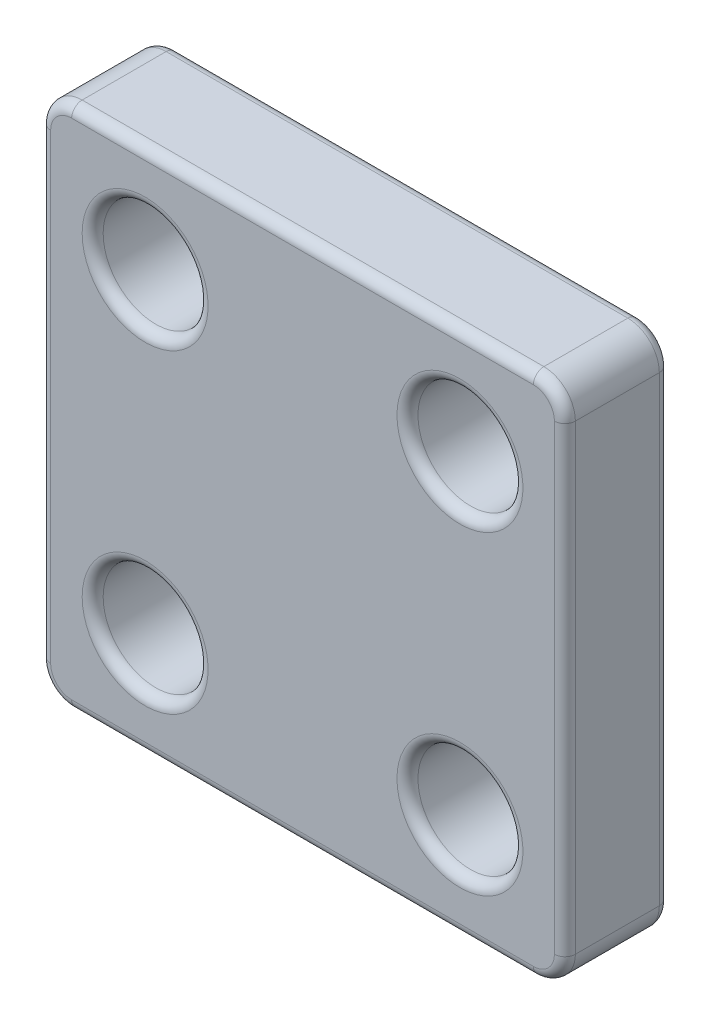
ISO-10303-21;
HEADER;
FILE_DESCRIPTION(('STEP AP214'),'2;1');
FILE_NAME('part.step','',(''),(''),'','','');
FILE_SCHEMA(('AUTOMOTIVE_DESIGN { 1 0 10303 214 1 1 1 1 }'));
ENDSEC;
DATA;
#1=APPLICATION_CONTEXT('core data for automotive mechanical design processes');
#2=APPLICATION_PROTOCOL_DEFINITION('international standard','automotive_design',2000,#1);
#3=PRODUCT_CONTEXT('',#1,'mechanical');
#4=PRODUCT('Part','Part','',(#3));
#5=PRODUCT_RELATED_PRODUCT_CATEGORY('part','',(#4));
#6=PRODUCT_DEFINITION_FORMATION('','',#4);
#7=PRODUCT_DEFINITION_CONTEXT('part definition',#1,'design');
#8=PRODUCT_DEFINITION('design','',#6,#7);
#9=PRODUCT_DEFINITION_SHAPE('','',#8);
#10=(LENGTH_UNIT() NAMED_UNIT(*) SI_UNIT(.MILLI.,.METRE.));
#11=(NAMED_UNIT(*) PLANE_ANGLE_UNIT() SI_UNIT($,.RADIAN.));
#12=(NAMED_UNIT(*) SI_UNIT($,.STERADIAN.) SOLID_ANGLE_UNIT());
#13=UNCERTAINTY_MEASURE_WITH_UNIT(LENGTH_MEASURE(1.E-05),#10,'distance_accuracy_value','');
#14=(GEOMETRIC_REPRESENTATION_CONTEXT(3) GLOBAL_UNCERTAINTY_ASSIGNED_CONTEXT((#13)) GLOBAL_UNIT_ASSIGNED_CONTEXT((#10,
#11,#12)) REPRESENTATION_CONTEXT('',''));
#15=CARTESIAN_POINT('',(0.,0.,0.));
#16=DIRECTION('',(0.,0.,1.));
#17=DIRECTION('',(1.,0.,0.));
#18=AXIS2_PLACEMENT_3D('',#15,#16,#17);
#19=CARTESIAN_POINT('',(-25.,25.,10.));
#20=DIRECTION('',(1.,0.,0.));
#21=DIRECTION('',(0.,1.,0.));
#22=AXIS2_PLACEMENT_3D('',#19,#20,#21);
#23=PLANE('',#22);
#24=DIRECTION('',(0.,0.,-1.));
#25=VECTOR('',#24,1.);
#26=CARTESIAN_POINT('',(-25.,22.,10.));
#27=LINE('',#26,#25);
#28=CARTESIAN_POINT('',(-25.,22.,9.));
#29=VERTEX_POINT('',#28);
#30=CARTESIAN_POINT('',(-25.,22.,0.999999999999999));
#31=VERTEX_POINT('',#30);
#32=EDGE_CURVE('E416',#29,#31,#27,.T.);
#33=ORIENTED_EDGE('',*,*,#32,.T.);
#34=DIRECTION('',(0.,-1.,0.));
#35=VECTOR('',#34,1.);
#36=CARTESIAN_POINT('',(-25.,-22.,0.999999999999999));
#37=LINE('',#36,#35);
#38=CARTESIAN_POINT('',(-25.,-22.,0.999999999999999));
#39=VERTEX_POINT('',#38);
#40=EDGE_CURVE('E260',#31,#39,#37,.T.);
#41=ORIENTED_EDGE('',*,*,#40,.T.);
#42=DIRECTION('',(0.,0.,-1.));
#43=VECTOR('',#42,1.);
#44=CARTESIAN_POINT('',(-25.,-22.,10.));
#45=LINE('',#44,#43);
#46=CARTESIAN_POINT('',(-25.,-22.,9.));
#47=VERTEX_POINT('',#46);
#48=EDGE_CURVE('E362',#39,#47,#45,.F.);
#49=ORIENTED_EDGE('',*,*,#48,.T.);
#50=DIRECTION('',(0.,-1.,0.));
#51=VECTOR('',#50,1.);
#52=CARTESIAN_POINT('',(-25.,25.,9.));
#53=LINE('',#52,#51);
#54=EDGE_CURVE('E257',#47,#29,#53,.F.);
#55=ORIENTED_EDGE('',*,*,#54,.T.);
#56=EDGE_LOOP('',(#33,#41,#49,#55));
#57=FACE_BOUND('',#56,.T.);
#58=ADVANCED_FACE('F41',(#57),#23,.F.);
#59=CARTESIAN_POINT('',(25.,-25.,10.));
#60=DIRECTION('',(0.,1.,0.));
#61=DIRECTION('',(-1.,0.,0.));
#62=AXIS2_PLACEMENT_3D('',#59,#60,#61);
#63=PLANE('',#62);
#64=DIRECTION('',(0.,0.,-1.));
#65=VECTOR('',#64,1.);
#66=CARTESIAN_POINT('',(-22.,-25.,10.));
#67=LINE('',#66,#65);
#68=CARTESIAN_POINT('',(-22.,-25.,9.));
#69=VERTEX_POINT('',#68);
#70=CARTESIAN_POINT('',(-22.,-25.,0.999999999999999));
#71=VERTEX_POINT('',#70);
#72=EDGE_CURVE('E410',#69,#71,#67,.T.);
#73=ORIENTED_EDGE('',*,*,#72,.T.);
#74=DIRECTION('',(1.,0.,0.));
#75=VECTOR('',#74,1.);
#76=CARTESIAN_POINT('',(22.,-25.,0.999999999999999));
#77=LINE('',#76,#75);
#78=CARTESIAN_POINT('',(22.,-25.,0.999999999999999));
#79=VERTEX_POINT('',#78);
#80=EDGE_CURVE('E248',#71,#79,#77,.T.);
#81=ORIENTED_EDGE('',*,*,#80,.T.);
#82=DIRECTION('',(0.,0.,-1.));
#83=VECTOR('',#82,1.);
#84=CARTESIAN_POINT('',(22.,-25.,10.));
#85=LINE('',#84,#83);
#86=CARTESIAN_POINT('',(22.,-25.,9.));
#87=VERTEX_POINT('',#86);
#88=EDGE_CURVE('E429',#79,#87,#85,.F.);
#89=ORIENTED_EDGE('',*,*,#88,.T.);
#90=DIRECTION('',(1.,0.,0.));
#91=VECTOR('',#90,1.);
#92=CARTESIAN_POINT('',(25.,-25.,9.));
#93=LINE('',#92,#91);
#94=EDGE_CURVE('E245',#87,#69,#93,.F.);
#95=ORIENTED_EDGE('',*,*,#94,.T.);
#96=EDGE_LOOP('',(#73,#81,#89,#95));
#97=FACE_BOUND('',#96,.T.);
#98=ADVANCED_FACE('F479',(#97),#63,.F.);
#99=CARTESIAN_POINT('',(25.,25.,10.));
#100=DIRECTION('',(-1.,0.,0.));
#101=DIRECTION('',(0.,-1.,0.));
#102=AXIS2_PLACEMENT_3D('',#99,#100,#101);
#103=PLANE('',#102);
#104=DIRECTION('',(0.,0.,-1.));
#105=VECTOR('',#104,1.);
#106=CARTESIAN_POINT('',(25.,-22.,10.));
#107=LINE('',#106,#105);
#108=CARTESIAN_POINT('',(25.,-22.,9.));
#109=VERTEX_POINT('',#108);
#110=CARTESIAN_POINT('',(25.,-22.,0.999999999999999));
#111=VERTEX_POINT('',#110);
#112=EDGE_CURVE('E184',#109,#111,#107,.T.);
#113=ORIENTED_EDGE('',*,*,#112,.T.);
#114=DIRECTION('',(0.,1.,0.));
#115=VECTOR('',#114,1.);
#116=CARTESIAN_POINT('',(25.,22.,0.999999999999999));
#117=LINE('',#116,#115);
#118=CARTESIAN_POINT('',(25.,22.,0.999999999999999));
#119=VERTEX_POINT('',#118);
#120=EDGE_CURVE('E236',#111,#119,#117,.T.);
#121=ORIENTED_EDGE('',*,*,#120,.T.);
#122=DIRECTION('',(0.,0.,-1.));
#123=VECTOR('',#122,1.);
#124=CARTESIAN_POINT('',(25.,22.,10.));
#125=LINE('',#124,#123);
#126=CARTESIAN_POINT('',(25.,22.,9.));
#127=VERTEX_POINT('',#126);
#128=EDGE_CURVE('E188',#119,#127,#125,.F.);
#129=ORIENTED_EDGE('',*,*,#128,.T.);
#130=DIRECTION('',(0.,1.,0.));
#131=VECTOR('',#130,1.);
#132=CARTESIAN_POINT('',(25.,25.,9.));
#133=LINE('',#132,#131);
#134=EDGE_CURVE('E233',#127,#109,#133,.F.);
#135=ORIENTED_EDGE('',*,*,#134,.T.);
#136=EDGE_LOOP('',(#113,#121,#129,#135));
#137=FACE_BOUND('',#136,.T.);
#138=ADVANCED_FACE('F438',(#137),#103,.F.);
#139=CARTESIAN_POINT('',(25.,25.,10.));
#140=DIRECTION('',(0.,-1.,0.));
#141=DIRECTION('',(1.,0.,0.));
#142=AXIS2_PLACEMENT_3D('',#139,#140,#141);
#143=PLANE('',#142);
#144=DIRECTION('',(0.,0.,-1.));
#145=VECTOR('',#144,1.);
#146=CARTESIAN_POINT('',(22.,25.,10.));
#147=LINE('',#146,#145);
#148=CARTESIAN_POINT('',(22.,25.,9.));
#149=VERTEX_POINT('',#148);
#150=CARTESIAN_POINT('',(22.,25.,0.999999999999999));
#151=VERTEX_POINT('',#150);
#152=EDGE_CURVE('E419',#149,#151,#147,.T.);
#153=ORIENTED_EDGE('',*,*,#152,.T.);
#154=DIRECTION('',(-1.,0.,0.));
#155=VECTOR('',#154,1.);
#156=CARTESIAN_POINT('',(-22.,25.,0.999999999999999));
#157=LINE('',#156,#155);
#158=CARTESIAN_POINT('',(-22.,25.,0.999999999999999));
#159=VERTEX_POINT('',#158);
#160=EDGE_CURVE('E11',#151,#159,#157,.T.);
#161=ORIENTED_EDGE('',*,*,#160,.T.);
#162=DIRECTION('',(0.,0.,-1.));
#163=VECTOR('',#162,1.);
#164=CARTESIAN_POINT('',(-22.,25.,10.));
#165=LINE('',#164,#163);
#166=CARTESIAN_POINT('',(-22.,25.,9.));
#167=VERTEX_POINT('',#166);
#168=EDGE_CURVE('E425',#159,#167,#165,.F.);
#169=ORIENTED_EDGE('',*,*,#168,.T.);
#170=DIRECTION('',(-1.,0.,0.));
#171=VECTOR('',#170,1.);
#172=CARTESIAN_POINT('',(25.,25.,9.));
#173=LINE('',#172,#171);
#174=EDGE_CURVE('E51',#167,#149,#173,.F.);
#175=ORIENTED_EDGE('',*,*,#174,.T.);
#176=EDGE_LOOP('',(#153,#161,#169,#175));
#177=FACE_BOUND('',#176,.T.);
#178=ADVANCED_FACE('F793',(#177),#143,.F.);
#179=CARTESIAN_POINT('',(0.,0.,10.));
#180=DIRECTION('',(0.,0.,-1.));
#181=DIRECTION('',(-1.,0.,0.));
#182=AXIS2_PLACEMENT_3D('',#179,#180,#181);
#183=PLANE('',#182);
#184=CARTESIAN_POINT('',(15.,-15.,10.));
#185=DIRECTION('',(0.,0.,-1.));
#186=DIRECTION('',(-1.,0.,0.));
#187=AXIS2_PLACEMENT_3D('',#184,#185,#186);
#188=CIRCLE('',#187,6.);
#189=CARTESIAN_POINT('',(9.,-15.,10.));
#190=VERTEX_POINT('',#189);
#191=EDGE_CURVE('E302',#190,#190,#188,.T.);
#192=ORIENTED_EDGE('',*,*,#191,.T.);
#193=EDGE_LOOP('',(#192));
#194=FACE_BOUND('',#193,.T.);
#195=CARTESIAN_POINT('',(-15.,-15.,10.));
#196=DIRECTION('',(0.,0.,-1.));
#197=DIRECTION('',(-1.,0.,0.));
#198=AXIS2_PLACEMENT_3D('',#195,#196,#197);
#199=CIRCLE('',#198,6.);
#200=CARTESIAN_POINT('',(-21.,-15.,10.));
#201=VERTEX_POINT('',#200);
#202=EDGE_CURVE('E298',#201,#201,#199,.T.);
#203=ORIENTED_EDGE('',*,*,#202,.T.);
#204=EDGE_LOOP('',(#203));
#205=FACE_BOUND('',#204,.T.);
#206=CARTESIAN_POINT('',(-15.,15.,10.));
#207=DIRECTION('',(0.,0.,-1.));
#208=DIRECTION('',(-1.,0.,0.));
#209=AXIS2_PLACEMENT_3D('',#206,#207,#208);
#210=CIRCLE('',#209,6.);
#211=CARTESIAN_POINT('',(-21.,15.,10.));
#212=VERTEX_POINT('',#211);
#213=EDGE_CURVE('E294',#212,#212,#210,.T.);
#214=ORIENTED_EDGE('',*,*,#213,.T.);
#215=EDGE_LOOP('',(#214));
#216=FACE_BOUND('',#215,.T.);
#217=CARTESIAN_POINT('',(15.,15.,10.));
#218=DIRECTION('',(0.,0.,-1.));
#219=DIRECTION('',(-1.,0.,0.));
#220=AXIS2_PLACEMENT_3D('',#217,#218,#219);
#221=CIRCLE('',#220,6.);
#222=CARTESIAN_POINT('',(9.,15.,10.));
#223=VERTEX_POINT('',#222);
#224=EDGE_CURVE('E290',#223,#223,#221,.T.);
#225=ORIENTED_EDGE('',*,*,#224,.T.);
#226=EDGE_LOOP('',(#225));
#227=FACE_BOUND('',#226,.T.);
#228=DIRECTION('',(0.,1.,0.));
#229=VECTOR('',#228,1.);
#230=CARTESIAN_POINT('',(24.,0.,10.));
#231=LINE('',#230,#229);
#232=CARTESIAN_POINT('',(24.,-22.,10.));
#233=VERTEX_POINT('',#232);
#234=CARTESIAN_POINT('',(24.,22.,10.));
#235=VERTEX_POINT('',#234);
#236=EDGE_CURVE('E59',#233,#235,#231,.T.);
#237=ORIENTED_EDGE('',*,*,#236,.T.);
#238=CARTESIAN_POINT('',(22.,22.,10.));
#239=DIRECTION('',(0.,0.,-1.));
#240=DIRECTION('',(-1.,0.,0.));
#241=AXIS2_PLACEMENT_3D('',#238,#239,#240);
#242=CIRCLE('',#241,2.);
#243=CARTESIAN_POINT('',(22.,24.,10.));
#244=VERTEX_POINT('',#243);
#245=EDGE_CURVE('E287',#235,#244,#242,.F.);
#246=ORIENTED_EDGE('',*,*,#245,.T.);
#247=DIRECTION('',(-1.,0.,0.));
#248=VECTOR('',#247,1.);
#249=CARTESIAN_POINT('',(0.,24.,10.));
#250=LINE('',#249,#248);
#251=CARTESIAN_POINT('',(-22.,24.,10.));
#252=VERTEX_POINT('',#251);
#253=EDGE_CURVE('E268',#244,#252,#250,.T.);
#254=ORIENTED_EDGE('',*,*,#253,.T.);
#255=CARTESIAN_POINT('',(-22.,22.,10.));
#256=DIRECTION('',(0.,0.,-1.));
#257=DIRECTION('',(-1.,0.,0.));
#258=AXIS2_PLACEMENT_3D('',#255,#256,#257);
#259=CIRCLE('',#258,2.);
#260=CARTESIAN_POINT('',(-24.,22.,10.));
#261=VERTEX_POINT('',#260);
#262=EDGE_CURVE('E271',#252,#261,#259,.F.);
#263=ORIENTED_EDGE('',*,*,#262,.T.);
#264=DIRECTION('',(0.,-1.,0.));
#265=VECTOR('',#264,1.);
#266=CARTESIAN_POINT('',(-24.,0.,10.));
#267=LINE('',#266,#265);
#268=CARTESIAN_POINT('',(-24.,-22.,10.));
#269=VERTEX_POINT('',#268);
#270=EDGE_CURVE('E274',#261,#269,#267,.T.);
#271=ORIENTED_EDGE('',*,*,#270,.T.);
#272=CARTESIAN_POINT('',(-22.,-22.,10.));
#273=DIRECTION('',(0.,0.,-1.));
#274=DIRECTION('',(-1.,0.,0.));
#275=AXIS2_PLACEMENT_3D('',#272,#273,#274);
#276=CIRCLE('',#275,2.);
#277=CARTESIAN_POINT('',(-22.,-24.,10.));
#278=VERTEX_POINT('',#277);
#279=EDGE_CURVE('E277',#269,#278,#276,.F.);
#280=ORIENTED_EDGE('',*,*,#279,.T.);
#281=DIRECTION('',(1.,0.,0.));
#282=VECTOR('',#281,1.);
#283=CARTESIAN_POINT('',(0.,-24.,10.));
#284=LINE('',#283,#282);
#285=CARTESIAN_POINT('',(22.,-24.,10.));
#286=VERTEX_POINT('',#285);
#287=EDGE_CURVE('E280',#278,#286,#284,.T.);
#288=ORIENTED_EDGE('',*,*,#287,.T.);
#289=CARTESIAN_POINT('',(22.,-22.,10.));
#290=DIRECTION('',(0.,0.,-1.));
#291=DIRECTION('',(-1.,0.,0.));
#292=AXIS2_PLACEMENT_3D('',#289,#290,#291);
#293=CIRCLE('',#292,2.);
#294=EDGE_CURVE('E64',#286,#233,#293,.F.);
#295=ORIENTED_EDGE('',*,*,#294,.T.);
#296=EDGE_LOOP('',(#237,#246,#254,#263,#271,#280,#288,#295));
#297=FACE_BOUND('',#296,.T.);
#298=ADVANCED_FACE('F784',(#194,#205,#216,#227,#297),#183,.F.);
#299=CARTESIAN_POINT('',(0.,0.,0.));
#300=DIRECTION('',(0.,0.,-1.));
#301=DIRECTION('',(-1.,0.,0.));
#302=AXIS2_PLACEMENT_3D('',#299,#300,#301);
#303=PLANE('',#302);
#304=CARTESIAN_POINT('',(15.,-15.,0.));
#305=DIRECTION('',(0.,0.,-1.));
#306=DIRECTION('',(-1.,0.,0.));
#307=AXIS2_PLACEMENT_3D('',#304,#305,#306);
#308=CIRCLE('',#307,6.);
#309=CARTESIAN_POINT('',(9.,-15.,0.));
#310=VERTEX_POINT('',#309);
#311=EDGE_CURVE('E221',#310,#310,#308,.F.);
#312=ORIENTED_EDGE('',*,*,#311,.T.);
#313=EDGE_LOOP('',(#312));
#314=FACE_BOUND('',#313,.T.);
#315=CARTESIAN_POINT('',(-15.,-15.,0.));
#316=DIRECTION('',(0.,0.,-1.));
#317=DIRECTION('',(-1.,0.,0.));
#318=AXIS2_PLACEMENT_3D('',#315,#316,#317);
#319=CIRCLE('',#318,6.);
#320=CARTESIAN_POINT('',(-21.,-15.,0.));
#321=VERTEX_POINT('',#320);
#322=EDGE_CURVE('E217',#321,#321,#319,.F.);
#323=ORIENTED_EDGE('',*,*,#322,.T.);
#324=EDGE_LOOP('',(#323));
#325=FACE_BOUND('',#324,.T.);
#326=CARTESIAN_POINT('',(-15.,15.,0.));
#327=DIRECTION('',(0.,0.,-1.));
#328=DIRECTION('',(-1.,0.,0.));
#329=AXIS2_PLACEMENT_3D('',#326,#327,#328);
#330=CIRCLE('',#329,6.);
#331=CARTESIAN_POINT('',(-21.,15.,0.));
#332=VERTEX_POINT('',#331);
#333=EDGE_CURVE('E213',#332,#332,#330,.F.);
#334=ORIENTED_EDGE('',*,*,#333,.T.);
#335=EDGE_LOOP('',(#334));
#336=FACE_BOUND('',#335,.T.);
#337=CARTESIAN_POINT('',(15.,15.,0.));
#338=DIRECTION('',(0.,0.,-1.));
#339=DIRECTION('',(-1.,0.,0.));
#340=AXIS2_PLACEMENT_3D('',#337,#338,#339);
#341=CIRCLE('',#340,6.);
#342=CARTESIAN_POINT('',(9.,15.,0.));
#343=VERTEX_POINT('',#342);
#344=EDGE_CURVE('E209',#343,#343,#341,.F.);
#345=ORIENTED_EDGE('',*,*,#344,.T.);
#346=EDGE_LOOP('',(#345));
#347=FACE_BOUND('',#346,.T.);
#348=DIRECTION('',(-1.,0.,0.));
#349=VECTOR('',#348,1.);
#350=CARTESIAN_POINT('',(22.,24.,0.));
#351=LINE('',#350,#349);
#352=CARTESIAN_POINT('',(-22.,24.,0.));
#353=VERTEX_POINT('',#352);
#354=CARTESIAN_POINT('',(22.,24.,0.));
#355=VERTEX_POINT('',#354);
#356=EDGE_CURVE('E160',#353,#355,#351,.F.);
#357=ORIENTED_EDGE('',*,*,#356,.T.);
#358=CARTESIAN_POINT('',(22.,22.,0.));
#359=DIRECTION('',(0.,0.,-1.));
#360=DIRECTION('',(-1.,0.,0.));
#361=AXIS2_PLACEMENT_3D('',#358,#359,#360);
#362=CIRCLE('',#361,2.);
#363=CARTESIAN_POINT('',(24.,22.,0.));
#364=VERTEX_POINT('',#363);
#365=EDGE_CURVE('E206',#355,#364,#362,.T.);
#366=ORIENTED_EDGE('',*,*,#365,.T.);
#367=DIRECTION('',(0.,1.,0.));
#368=VECTOR('',#367,1.);
#369=CARTESIAN_POINT('',(24.,-22.,0.));
#370=LINE('',#369,#368);
#371=CARTESIAN_POINT('',(24.,-22.,0.));
#372=VERTEX_POINT('',#371);
#373=EDGE_CURVE('E203',#364,#372,#370,.F.);
#374=ORIENTED_EDGE('',*,*,#373,.T.);
#375=CARTESIAN_POINT('',(22.,-22.,0.));
#376=DIRECTION('',(0.,0.,-1.));
#377=DIRECTION('',(-1.,0.,0.));
#378=AXIS2_PLACEMENT_3D('',#375,#376,#377);
#379=CIRCLE('',#378,2.);
#380=CARTESIAN_POINT('',(22.,-24.,0.));
#381=VERTEX_POINT('',#380);
#382=EDGE_CURVE('E200',#372,#381,#379,.T.);
#383=ORIENTED_EDGE('',*,*,#382,.T.);
#384=DIRECTION('',(1.,0.,0.));
#385=VECTOR('',#384,1.);
#386=CARTESIAN_POINT('',(-22.,-24.,0.));
#387=LINE('',#386,#385);
#388=CARTESIAN_POINT('',(-22.,-24.,0.));
#389=VERTEX_POINT('',#388);
#390=EDGE_CURVE('E197',#381,#389,#387,.F.);
#391=ORIENTED_EDGE('',*,*,#390,.T.);
#392=CARTESIAN_POINT('',(-22.,-22.,0.));
#393=DIRECTION('',(0.,0.,-1.));
#394=DIRECTION('',(-1.,0.,0.));
#395=AXIS2_PLACEMENT_3D('',#392,#393,#394);
#396=CIRCLE('',#395,2.);
#397=CARTESIAN_POINT('',(-24.,-22.,0.));
#398=VERTEX_POINT('',#397);
#399=EDGE_CURVE('E194',#389,#398,#396,.T.);
#400=ORIENTED_EDGE('',*,*,#399,.T.);
#401=DIRECTION('',(0.,-1.,0.));
#402=VECTOR('',#401,1.);
#403=CARTESIAN_POINT('',(-24.,22.,0.));
#404=LINE('',#403,#402);
#405=CARTESIAN_POINT('',(-24.,22.,0.));
#406=VERTEX_POINT('',#405);
#407=EDGE_CURVE('E163',#398,#406,#404,.F.);
#408=ORIENTED_EDGE('',*,*,#407,.T.);
#409=CARTESIAN_POINT('',(-22.,22.,0.));
#410=DIRECTION('',(0.,0.,-1.));
#411=DIRECTION('',(-1.,0.,0.));
#412=AXIS2_PLACEMENT_3D('',#409,#410,#411);
#413=CIRCLE('',#412,2.);
#414=EDGE_CURVE('E155',#406,#353,#413,.T.);
#415=ORIENTED_EDGE('',*,*,#414,.T.);
#416=EDGE_LOOP('',(#357,#366,#374,#383,#391,#400,#408,#415));
#417=FACE_BOUND('',#416,.T.);
#418=ADVANCED_FACE('F157',(#314,#325,#336,#347,#417),#303,.T.);
#419=CARTESIAN_POINT('',(15.,15.,0.));
#420=DIRECTION('',(0.,0.,1.));
#421=DIRECTION('',(1.,0.,0.));
#422=AXIS2_PLACEMENT_3D('',#419,#420,#421);
#423=CYLINDRICAL_SURFACE('',#422,5.);
#424=CARTESIAN_POINT('',(15.,15.,9.));
#425=DIRECTION('',(0.,0.,-1.));
#426=DIRECTION('',(-1.,0.,0.));
#427=AXIS2_PLACEMENT_3D('',#424,#425,#426);
#428=CIRCLE('',#427,5.);
#429=CARTESIAN_POINT('',(10.,15.,9.));
#430=VERTEX_POINT('',#429);
#431=EDGE_CURVE('E334',#430,#430,#428,.F.);
#432=ORIENTED_EDGE('',*,*,#431,.T.);
#433=EDGE_LOOP('',(#432));
#434=FACE_BOUND('',#433,.T.);
#435=CARTESIAN_POINT('',(15.,15.,1.));
#436=DIRECTION('',(0.,0.,-1.));
#437=DIRECTION('',(-1.,0.,0.));
#438=AXIS2_PLACEMENT_3D('',#435,#436,#437);
#439=CIRCLE('',#438,5.);
#440=CARTESIAN_POINT('',(10.,15.,1.));
#441=VERTEX_POINT('',#440);
#442=EDGE_CURVE('E330',#441,#441,#439,.T.);
#443=ORIENTED_EDGE('',*,*,#442,.T.);
#444=EDGE_LOOP('',(#443));
#445=FACE_BOUND('',#444,.T.);
#446=ADVANCED_FACE('F767',(#434,#445),#423,.F.);
#447=CARTESIAN_POINT('',(15.,-15.,0.));
#448=DIRECTION('',(0.,0.,1.));
#449=DIRECTION('',(1.,0.,0.));
#450=AXIS2_PLACEMENT_3D('',#447,#448,#449);
#451=CYLINDRICAL_SURFACE('',#450,5.);
#452=CARTESIAN_POINT('',(15.,-15.,1.));
#453=DIRECTION('',(0.,0.,-1.));
#454=DIRECTION('',(-1.,0.,0.));
#455=AXIS2_PLACEMENT_3D('',#452,#453,#454);
#456=CIRCLE('',#455,5.);
#457=CARTESIAN_POINT('',(10.,-15.,1.));
#458=VERTEX_POINT('',#457);
#459=EDGE_CURVE('E310',#458,#458,#456,.T.);
#460=ORIENTED_EDGE('',*,*,#459,.T.);
#461=EDGE_LOOP('',(#460));
#462=FACE_BOUND('',#461,.T.);
#463=CARTESIAN_POINT('',(15.,-15.,9.));
#464=DIRECTION('',(0.,0.,-1.));
#465=DIRECTION('',(-1.,0.,0.));
#466=AXIS2_PLACEMENT_3D('',#463,#464,#465);
#467=CIRCLE('',#466,5.);
#468=CARTESIAN_POINT('',(10.,-15.,9.));
#469=VERTEX_POINT('',#468);
#470=EDGE_CURVE('E306',#469,#469,#467,.F.);
#471=ORIENTED_EDGE('',*,*,#470,.T.);
#472=EDGE_LOOP('',(#471));
#473=FACE_BOUND('',#472,.T.);
#474=ADVANCED_FACE('F758',(#462,#473),#451,.F.);
#475=CARTESIAN_POINT('',(-15.,-15.,0.));
#476=DIRECTION('',(0.,0.,1.));
#477=DIRECTION('',(1.,0.,0.));
#478=AXIS2_PLACEMENT_3D('',#475,#476,#477);
#479=CYLINDRICAL_SURFACE('',#478,5.);
#480=CARTESIAN_POINT('',(-15.,-15.,1.));
#481=DIRECTION('',(0.,0.,-1.));
#482=DIRECTION('',(-1.,0.,0.));
#483=AXIS2_PLACEMENT_3D('',#480,#481,#482);
#484=CIRCLE('',#483,5.);
#485=CARTESIAN_POINT('',(-20.,-15.,1.));
#486=VERTEX_POINT('',#485);
#487=EDGE_CURVE('E318',#486,#486,#484,.T.);
#488=ORIENTED_EDGE('',*,*,#487,.T.);
#489=EDGE_LOOP('',(#488));
#490=FACE_BOUND('',#489,.T.);
#491=CARTESIAN_POINT('',(-15.,-15.,9.));
#492=DIRECTION('',(0.,0.,-1.));
#493=DIRECTION('',(-1.,0.,0.));
#494=AXIS2_PLACEMENT_3D('',#491,#492,#493);
#495=CIRCLE('',#494,5.);
#496=CARTESIAN_POINT('',(-20.,-15.,9.));
#497=VERTEX_POINT('',#496);
#498=EDGE_CURVE('E314',#497,#497,#495,.F.);
#499=ORIENTED_EDGE('',*,*,#498,.T.);
#500=EDGE_LOOP('',(#499));
#501=FACE_BOUND('',#500,.T.);
#502=ADVANCED_FACE('F749',(#490,#501),#479,.F.);
#503=CARTESIAN_POINT('',(-15.,15.,0.));
#504=DIRECTION('',(0.,0.,1.));
#505=DIRECTION('',(1.,0.,0.));
#506=AXIS2_PLACEMENT_3D('',#503,#504,#505);
#507=CYLINDRICAL_SURFACE('',#506,5.);
#508=CARTESIAN_POINT('',(-15.,15.,9.));
#509=DIRECTION('',(0.,0.,-1.));
#510=DIRECTION('',(-1.,0.,0.));
#511=AXIS2_PLACEMENT_3D('',#508,#509,#510);
#512=CIRCLE('',#511,5.);
#513=CARTESIAN_POINT('',(-20.,15.,9.));
#514=VERTEX_POINT('',#513);
#515=EDGE_CURVE('E326',#514,#514,#512,.F.);
#516=ORIENTED_EDGE('',*,*,#515,.T.);
#517=EDGE_LOOP('',(#516));
#518=FACE_BOUND('',#517,.T.);
#519=CARTESIAN_POINT('',(-15.,15.,1.));
#520=DIRECTION('',(0.,0.,-1.));
#521=DIRECTION('',(-1.,0.,0.));
#522=AXIS2_PLACEMENT_3D('',#519,#520,#521);
#523=CIRCLE('',#522,5.);
#524=CARTESIAN_POINT('',(-20.,15.,1.));
#525=VERTEX_POINT('',#524);
#526=EDGE_CURVE('E322',#525,#525,#523,.T.);
#527=ORIENTED_EDGE('',*,*,#526,.T.);
#528=EDGE_LOOP('',(#527));
#529=FACE_BOUND('',#528,.T.);
#530=ADVANCED_FACE('F491',(#518,#529),#507,.F.);
#531=CARTESIAN_POINT('',(-22.,22.,10.));
#532=DIRECTION('',(0.,0.,-1.));
#533=DIRECTION('',(-1.,0.,0.));
#534=AXIS2_PLACEMENT_3D('',#531,#532,#533);
#535=CYLINDRICAL_SURFACE('',#534,3.);
#536=ORIENTED_EDGE('',*,*,#168,.F.);
#537=CARTESIAN_POINT('',(-22.,22.,0.999999999999999));
#538=DIRECTION('',(0.,0.,-1.));
#539=DIRECTION('',(-1.,0.,0.));
#540=AXIS2_PLACEMENT_3D('',#537,#538,#539);
#541=CIRCLE('',#540,3.);
#542=EDGE_CURVE('E173',#159,#31,#541,.F.);
#543=ORIENTED_EDGE('',*,*,#542,.T.);
#544=ORIENTED_EDGE('',*,*,#32,.F.);
#545=CARTESIAN_POINT('',(-22.,22.,9.));
#546=DIRECTION('',(0.,0.,-1.));
#547=DIRECTION('',(-1.,0.,0.));
#548=AXIS2_PLACEMENT_3D('',#545,#546,#547);
#549=CIRCLE('',#548,3.);
#550=EDGE_CURVE('E263',#29,#167,#549,.T.);
#551=ORIENTED_EDGE('',*,*,#550,.T.);
#552=EDGE_LOOP('',(#536,#543,#544,#551));
#553=FACE_BOUND('',#552,.T.);
#554=ADVANCED_FACE('F488',(#553),#535,.T.);
#555=CARTESIAN_POINT('',(-22.,-22.,10.));
#556=DIRECTION('',(0.,0.,-1.));
#557=DIRECTION('',(-1.,0.,0.));
#558=AXIS2_PLACEMENT_3D('',#555,#556,#557);
#559=CYLINDRICAL_SURFACE('',#558,3.);
#560=ORIENTED_EDGE('',*,*,#48,.F.);
#561=CARTESIAN_POINT('',(-22.,-22.,0.999999999999999));
#562=DIRECTION('',(0.,0.,-1.));
#563=DIRECTION('',(-1.,0.,0.));
#564=AXIS2_PLACEMENT_3D('',#561,#562,#563);
#565=CIRCLE('',#564,3.);
#566=EDGE_CURVE('E254',#39,#71,#565,.F.);
#567=ORIENTED_EDGE('',*,*,#566,.T.);
#568=ORIENTED_EDGE('',*,*,#72,.F.);
#569=CARTESIAN_POINT('',(-22.,-22.,9.));
#570=DIRECTION('',(0.,0.,-1.));
#571=DIRECTION('',(-1.,0.,0.));
#572=AXIS2_PLACEMENT_3D('',#569,#570,#571);
#573=CIRCLE('',#572,3.);
#574=EDGE_CURVE('E251',#69,#47,#573,.T.);
#575=ORIENTED_EDGE('',*,*,#574,.T.);
#576=EDGE_LOOP('',(#560,#567,#568,#575));
#577=FACE_BOUND('',#576,.T.);
#578=ADVANCED_FACE('F407',(#577),#559,.T.);
#579=CARTESIAN_POINT('',(22.,-22.,10.));
#580=DIRECTION('',(0.,0.,-1.));
#581=DIRECTION('',(-1.,0.,0.));
#582=AXIS2_PLACEMENT_3D('',#579,#580,#581);
#583=CYLINDRICAL_SURFACE('',#582,3.);
#584=ORIENTED_EDGE('',*,*,#88,.F.);
#585=CARTESIAN_POINT('',(22.,-22.,0.999999999999999));
#586=DIRECTION('',(0.,0.,-1.));
#587=DIRECTION('',(-1.,0.,0.));
#588=AXIS2_PLACEMENT_3D('',#585,#586,#587);
#589=CIRCLE('',#588,3.);
#590=EDGE_CURVE('E242',#79,#111,#589,.F.);
#591=ORIENTED_EDGE('',*,*,#590,.T.);
#592=ORIENTED_EDGE('',*,*,#112,.F.);
#593=CARTESIAN_POINT('',(22.,-22.,9.));
#594=DIRECTION('',(0.,0.,-1.));
#595=DIRECTION('',(-1.,0.,0.));
#596=AXIS2_PLACEMENT_3D('',#593,#594,#595);
#597=CIRCLE('',#596,3.);
#598=EDGE_CURVE('E239',#109,#87,#597,.T.);
#599=ORIENTED_EDGE('',*,*,#598,.T.);
#600=EDGE_LOOP('',(#584,#591,#592,#599));
#601=FACE_BOUND('',#600,.T.);
#602=ADVANCED_FACE('F495',(#601),#583,.T.);
#603=CARTESIAN_POINT('',(22.,22.,10.));
#604=DIRECTION('',(0.,0.,-1.));
#605=DIRECTION('',(-1.,0.,0.));
#606=AXIS2_PLACEMENT_3D('',#603,#604,#605);
#607=CYLINDRICAL_SURFACE('',#606,3.);
#608=ORIENTED_EDGE('',*,*,#128,.F.);
#609=CARTESIAN_POINT('',(22.,22.,0.999999999999999));
#610=DIRECTION('',(0.,0.,-1.));
#611=DIRECTION('',(-1.,0.,0.));
#612=AXIS2_PLACEMENT_3D('',#609,#610,#611);
#613=CIRCLE('',#612,3.);
#614=EDGE_CURVE('E229',#119,#151,#613,.F.);
#615=ORIENTED_EDGE('',*,*,#614,.T.);
#616=ORIENTED_EDGE('',*,*,#152,.F.);
#617=CARTESIAN_POINT('',(22.,22.,9.));
#618=DIRECTION('',(0.,0.,-1.));
#619=DIRECTION('',(-1.,0.,0.));
#620=AXIS2_PLACEMENT_3D('',#617,#618,#619);
#621=CIRCLE('',#620,3.);
#622=EDGE_CURVE('E225',#149,#127,#621,.T.);
#623=ORIENTED_EDGE('',*,*,#622,.T.);
#624=EDGE_LOOP('',(#608,#615,#616,#623));
#625=FACE_BOUND('',#624,.T.);
#626=ADVANCED_FACE('F444',(#625),#607,.T.);
#627=CARTESIAN_POINT('',(-22.,-22.,0.999999999999999));
#628=DIRECTION('',(0.,0.,-1.));
#629=DIRECTION('',(-1.,0.,0.));
#630=AXIS2_PLACEMENT_3D('',#627,#628,#629);
#631=TOROIDAL_SURFACE('',#630,2.,1.);
#632=CARTESIAN_POINT('',(-22.,-24.,0.999999999999999));
#633=DIRECTION('',(1.,0.,0.));
#634=DIRECTION('',(0.,0.,-1.));
#635=AXIS2_PLACEMENT_3D('',#632,#633,#634);
#636=CIRCLE('',#635,1.);
#637=EDGE_CURVE('E354',#71,#389,#636,.T.);
#638=ORIENTED_EDGE('',*,*,#637,.F.);
#639=ORIENTED_EDGE('',*,*,#566,.F.);
#640=CARTESIAN_POINT('',(-24.,-22.,1.));
#641=DIRECTION('',(0.,1.,0.));
#642=DIRECTION('',(0.,0.,1.));
#643=AXIS2_PLACEMENT_3D('',#640,#641,#642);
#644=CIRCLE('',#643,1.);
#645=EDGE_CURVE('E358',#398,#39,#644,.T.);
#646=ORIENTED_EDGE('',*,*,#645,.F.);
#647=ORIENTED_EDGE('',*,*,#399,.F.);
#648=EDGE_LOOP('',(#638,#639,#646,#647));
#649=FACE_BOUND('',#648,.T.);
#650=ADVANCED_FACE('F467',(#649),#631,.T.);
#651=CARTESIAN_POINT('',(-24.,25.,0.999999999999999));
#652=DIRECTION('',(0.,1.,0.));
#653=DIRECTION('',(-1.,0.,0.));
#654=AXIS2_PLACEMENT_3D('',#651,#652,#653);
#655=CYLINDRICAL_SURFACE('',#654,1.);
#656=ORIENTED_EDGE('',*,*,#645,.T.);
#657=ORIENTED_EDGE('',*,*,#40,.F.);
#658=CARTESIAN_POINT('',(-24.,22.,1.));
#659=DIRECTION('',(0.,1.,0.));
#660=DIRECTION('',(0.,0.,1.));
#661=AXIS2_PLACEMENT_3D('',#658,#659,#660);
#662=CIRCLE('',#661,1.);
#663=EDGE_CURVE('E351',#406,#31,#662,.T.);
#664=ORIENTED_EDGE('',*,*,#663,.F.);
#665=ORIENTED_EDGE('',*,*,#407,.F.);
#666=EDGE_LOOP('',(#656,#657,#664,#665));
#667=FACE_BOUND('',#666,.T.);
#668=ADVANCED_FACE('F469',(#667),#655,.T.);
#669=CARTESIAN_POINT('',(25.,-24.,0.999999999999999));
#670=DIRECTION('',(-1.,0.,0.));
#671=DIRECTION('',(0.,-1.,0.));
#672=AXIS2_PLACEMENT_3D('',#669,#670,#671);
#673=CYLINDRICAL_SURFACE('',#672,1.);
#674=ORIENTED_EDGE('',*,*,#637,.T.);
#675=ORIENTED_EDGE('',*,*,#390,.F.);
#676=CARTESIAN_POINT('',(22.,-24.,0.999999999999999));
#677=DIRECTION('',(1.,0.,0.));
#678=DIRECTION('',(0.,0.,-1.));
#679=AXIS2_PLACEMENT_3D('',#676,#677,#678);
#680=CIRCLE('',#679,1.);
#681=EDGE_CURVE('E177',#79,#381,#680,.T.);
#682=ORIENTED_EDGE('',*,*,#681,.F.);
#683=ORIENTED_EDGE('',*,*,#80,.F.);
#684=EDGE_LOOP('',(#674,#675,#682,#683));
#685=FACE_BOUND('',#684,.T.);
#686=ADVANCED_FACE('F462',(#685),#673,.T.);
#687=CARTESIAN_POINT('',(-22.,22.,0.999999999999999));
#688=DIRECTION('',(0.,0.,-1.));
#689=DIRECTION('',(-1.,0.,0.));
#690=AXIS2_PLACEMENT_3D('',#687,#688,#689);
#691=TOROIDAL_SURFACE('',#690,2.,1.);
#692=ORIENTED_EDGE('',*,*,#663,.T.);
#693=ORIENTED_EDGE('',*,*,#542,.F.);
#694=CARTESIAN_POINT('',(-22.,24.,1.));
#695=DIRECTION('',(1.,0.,0.));
#696=DIRECTION('',(0.,0.,-1.));
#697=AXIS2_PLACEMENT_3D('',#694,#695,#696);
#698=CIRCLE('',#697,1.);
#699=EDGE_CURVE('E171',#353,#159,#698,.T.);
#700=ORIENTED_EDGE('',*,*,#699,.F.);
#701=ORIENTED_EDGE('',*,*,#414,.F.);
#702=EDGE_LOOP('',(#692,#693,#700,#701));
#703=FACE_BOUND('',#702,.T.);
#704=ADVANCED_FACE('F172',(#703),#691,.T.);
#705=CARTESIAN_POINT('',(22.,-22.,0.999999999999999));
#706=DIRECTION('',(0.,0.,-1.));
#707=DIRECTION('',(-1.,0.,0.));
#708=AXIS2_PLACEMENT_3D('',#705,#706,#707);
#709=TOROIDAL_SURFACE('',#708,2.,1.);
#710=ORIENTED_EDGE('',*,*,#681,.T.);
#711=ORIENTED_EDGE('',*,*,#382,.F.);
#712=CARTESIAN_POINT('',(24.,-22.,0.999999999999999));
#713=DIRECTION('',(0.,1.,0.));
#714=DIRECTION('',(0.,0.,1.));
#715=AXIS2_PLACEMENT_3D('',#712,#713,#714);
#716=CIRCLE('',#715,1.);
#717=EDGE_CURVE('E178',#111,#372,#716,.T.);
#718=ORIENTED_EDGE('',*,*,#717,.F.);
#719=ORIENTED_EDGE('',*,*,#590,.F.);
#720=EDGE_LOOP('',(#710,#711,#718,#719));
#721=FACE_BOUND('',#720,.T.);
#722=ADVANCED_FACE('F457',(#721),#709,.T.);
#723=CARTESIAN_POINT('',(25.,24.,0.999999999999999));
#724=DIRECTION('',(1.,0.,0.));
#725=DIRECTION('',(0.,1.,0.));
#726=AXIS2_PLACEMENT_3D('',#723,#724,#725);
#727=CYLINDRICAL_SURFACE('',#726,1.);
#728=ORIENTED_EDGE('',*,*,#699,.T.);
#729=ORIENTED_EDGE('',*,*,#160,.F.);
#730=CARTESIAN_POINT('',(22.,24.,1.));
#731=DIRECTION('',(1.,0.,0.));
#732=DIRECTION('',(0.,0.,-1.));
#733=AXIS2_PLACEMENT_3D('',#730,#731,#732);
#734=CIRCLE('',#733,1.);
#735=EDGE_CURVE('E181',#355,#151,#734,.T.);
#736=ORIENTED_EDGE('',*,*,#735,.F.);
#737=ORIENTED_EDGE('',*,*,#356,.F.);
#738=EDGE_LOOP('',(#728,#729,#736,#737));
#739=FACE_BOUND('',#738,.T.);
#740=ADVANCED_FACE('F180',(#739),#727,.T.);
#741=CARTESIAN_POINT('',(24.,25.,0.999999999999999));
#742=DIRECTION('',(0.,-1.,0.));
#743=DIRECTION('',(1.,0.,0.));
#744=AXIS2_PLACEMENT_3D('',#741,#742,#743);
#745=CYLINDRICAL_SURFACE('',#744,1.);
#746=ORIENTED_EDGE('',*,*,#717,.T.);
#747=ORIENTED_EDGE('',*,*,#373,.F.);
#748=CARTESIAN_POINT('',(24.,22.,0.999999999999999));
#749=DIRECTION('',(0.,1.,0.));
#750=DIRECTION('',(0.,0.,1.));
#751=AXIS2_PLACEMENT_3D('',#748,#749,#750);
#752=CIRCLE('',#751,1.);
#753=EDGE_CURVE('E340',#119,#364,#752,.T.);
#754=ORIENTED_EDGE('',*,*,#753,.F.);
#755=ORIENTED_EDGE('',*,*,#120,.F.);
#756=EDGE_LOOP('',(#746,#747,#754,#755));
#757=FACE_BOUND('',#756,.T.);
#758=ADVANCED_FACE('F452',(#757),#745,.T.);
#759=CARTESIAN_POINT('',(22.,22.,0.999999999999999));
#760=DIRECTION('',(0.,0.,-1.));
#761=DIRECTION('',(-1.,0.,0.));
#762=AXIS2_PLACEMENT_3D('',#759,#760,#761);
#763=TOROIDAL_SURFACE('',#762,2.,1.);
#764=ORIENTED_EDGE('',*,*,#735,.T.);
#765=ORIENTED_EDGE('',*,*,#614,.F.);
#766=ORIENTED_EDGE('',*,*,#753,.T.);
#767=ORIENTED_EDGE('',*,*,#365,.F.);
#768=EDGE_LOOP('',(#764,#765,#766,#767));
#769=FACE_BOUND('',#768,.T.);
#770=ADVANCED_FACE('F449',(#769),#763,.T.);
#771=CARTESIAN_POINT('',(-22.,-22.,9.));
#772=DIRECTION('',(0.,0.,-1.));
#773=DIRECTION('',(-1.,0.,0.));
#774=AXIS2_PLACEMENT_3D('',#771,#772,#773);
#775=TOROIDAL_SURFACE('',#774,2.,1.);
#776=CARTESIAN_POINT('',(-24.,-22.,9.));
#777=DIRECTION('',(0.,1.,0.));
#778=DIRECTION('',(0.,0.,1.));
#779=AXIS2_PLACEMENT_3D('',#776,#777,#778);
#780=CIRCLE('',#779,1.);
#781=EDGE_CURVE('E384',#47,#269,#780,.T.);
#782=ORIENTED_EDGE('',*,*,#781,.F.);
#783=ORIENTED_EDGE('',*,*,#574,.F.);
#784=CARTESIAN_POINT('',(-22.,-24.,9.));
#785=DIRECTION('',(1.,0.,0.));
#786=DIRECTION('',(0.,0.,-1.));
#787=AXIS2_PLACEMENT_3D('',#784,#785,#786);
#788=CIRCLE('',#787,1.);
#789=EDGE_CURVE('E45',#278,#69,#788,.T.);
#790=ORIENTED_EDGE('',*,*,#789,.F.);
#791=ORIENTED_EDGE('',*,*,#279,.F.);
#792=EDGE_LOOP('',(#782,#783,#790,#791));
#793=FACE_BOUND('',#792,.T.);
#794=ADVANCED_FACE('F402',(#793),#775,.T.);
#795=CARTESIAN_POINT('',(0.,-24.,9.));
#796=DIRECTION('',(1.,0.,0.));
#797=DIRECTION('',(0.,1.,0.));
#798=AXIS2_PLACEMENT_3D('',#795,#796,#797);
#799=CYLINDRICAL_SURFACE('',#798,1.);
#800=ORIENTED_EDGE('',*,*,#789,.T.);
#801=ORIENTED_EDGE('',*,*,#94,.F.);
#802=CARTESIAN_POINT('',(22.,-24.,9.));
#803=DIRECTION('',(1.,0.,0.));
#804=DIRECTION('',(0.,0.,-1.));
#805=AXIS2_PLACEMENT_3D('',#802,#803,#804);
#806=CIRCLE('',#805,1.);
#807=EDGE_CURVE('E381',#286,#87,#806,.T.);
#808=ORIENTED_EDGE('',*,*,#807,.F.);
#809=ORIENTED_EDGE('',*,*,#287,.F.);
#810=EDGE_LOOP('',(#800,#801,#808,#809));
#811=FACE_BOUND('',#810,.T.);
#812=ADVANCED_FACE('F397',(#811),#799,.T.);
#813=CARTESIAN_POINT('',(-24.,0.,9.));
#814=DIRECTION('',(0.,-1.,0.));
#815=DIRECTION('',(1.,0.,0.));
#816=AXIS2_PLACEMENT_3D('',#813,#814,#815);
#817=CYLINDRICAL_SURFACE('',#816,1.);
#818=ORIENTED_EDGE('',*,*,#781,.T.);
#819=ORIENTED_EDGE('',*,*,#270,.F.);
#820=CARTESIAN_POINT('',(-24.,22.,9.));
#821=DIRECTION('',(0.,1.,0.));
#822=DIRECTION('',(0.,0.,1.));
#823=AXIS2_PLACEMENT_3D('',#820,#821,#822);
#824=CIRCLE('',#823,1.);
#825=EDGE_CURVE('E377',#29,#261,#824,.T.);
#826=ORIENTED_EDGE('',*,*,#825,.F.);
#827=ORIENTED_EDGE('',*,*,#54,.F.);
#828=EDGE_LOOP('',(#818,#819,#826,#827));
#829=FACE_BOUND('',#828,.T.);
#830=ADVANCED_FACE('F542',(#829),#817,.T.);
#831=CARTESIAN_POINT('',(22.,-22.,9.));
#832=DIRECTION('',(0.,0.,-1.));
#833=DIRECTION('',(-1.,0.,0.));
#834=AXIS2_PLACEMENT_3D('',#831,#832,#833);
#835=TOROIDAL_SURFACE('',#834,2.,1.);
#836=ORIENTED_EDGE('',*,*,#807,.T.);
#837=ORIENTED_EDGE('',*,*,#598,.F.);
#838=CARTESIAN_POINT('',(24.,-22.,9.));
#839=DIRECTION('',(0.,1.,0.));
#840=DIRECTION('',(0.,0.,1.));
#841=AXIS2_PLACEMENT_3D('',#838,#839,#840);
#842=CIRCLE('',#841,1.);
#843=EDGE_CURVE('E373',#233,#109,#842,.T.);
#844=ORIENTED_EDGE('',*,*,#843,.F.);
#845=ORIENTED_EDGE('',*,*,#294,.F.);
#846=EDGE_LOOP('',(#836,#837,#844,#845));
#847=FACE_BOUND('',#846,.T.);
#848=ADVANCED_FACE('F549',(#847),#835,.T.);
#849=CARTESIAN_POINT('',(-22.,22.,9.));
#850=DIRECTION('',(0.,0.,-1.));
#851=DIRECTION('',(-1.,0.,0.));
#852=AXIS2_PLACEMENT_3D('',#849,#850,#851);
#853=TOROIDAL_SURFACE('',#852,2.,1.);
#854=ORIENTED_EDGE('',*,*,#825,.T.);
#855=ORIENTED_EDGE('',*,*,#262,.F.);
#856=CARTESIAN_POINT('',(-22.,24.,9.));
#857=DIRECTION('',(1.,0.,0.));
#858=DIRECTION('',(0.,0.,-1.));
#859=AXIS2_PLACEMENT_3D('',#856,#857,#858);
#860=CIRCLE('',#859,1.);
#861=EDGE_CURVE('E369',#167,#252,#860,.T.);
#862=ORIENTED_EDGE('',*,*,#861,.F.);
#863=ORIENTED_EDGE('',*,*,#550,.F.);
#864=EDGE_LOOP('',(#854,#855,#862,#863));
#865=FACE_BOUND('',#864,.T.);
#866=ADVANCED_FACE('F556',(#865),#853,.T.);
#867=CARTESIAN_POINT('',(24.,0.,9.));
#868=DIRECTION('',(0.,1.,0.));
#869=DIRECTION('',(-1.,0.,0.));
#870=AXIS2_PLACEMENT_3D('',#867,#868,#869);
#871=CYLINDRICAL_SURFACE('',#870,1.);
#872=ORIENTED_EDGE('',*,*,#843,.T.);
#873=ORIENTED_EDGE('',*,*,#134,.F.);
#874=CARTESIAN_POINT('',(24.,22.,9.));
#875=DIRECTION('',(0.,1.,0.));
#876=DIRECTION('',(0.,0.,1.));
#877=AXIS2_PLACEMENT_3D('',#874,#875,#876);
#878=CIRCLE('',#877,1.);
#879=EDGE_CURVE('E366',#235,#127,#878,.T.);
#880=ORIENTED_EDGE('',*,*,#879,.F.);
#881=ORIENTED_EDGE('',*,*,#236,.F.);
#882=EDGE_LOOP('',(#872,#873,#880,#881));
#883=FACE_BOUND('',#882,.T.);
#884=ADVANCED_FACE('F564',(#883),#871,.T.);
#885=CARTESIAN_POINT('',(0.,24.,9.));
#886=DIRECTION('',(-1.,0.,0.));
#887=DIRECTION('',(0.,-1.,0.));
#888=AXIS2_PLACEMENT_3D('',#885,#886,#887);
#889=CYLINDRICAL_SURFACE('',#888,1.);
#890=ORIENTED_EDGE('',*,*,#861,.T.);
#891=ORIENTED_EDGE('',*,*,#253,.F.);
#892=CARTESIAN_POINT('',(22.,24.,9.));
#893=DIRECTION('',(1.,0.,0.));
#894=DIRECTION('',(0.,0.,-1.));
#895=AXIS2_PLACEMENT_3D('',#892,#893,#894);
#896=CIRCLE('',#895,1.);
#897=EDGE_CURVE('E363',#149,#244,#896,.T.);
#898=ORIENTED_EDGE('',*,*,#897,.F.);
#899=ORIENTED_EDGE('',*,*,#174,.F.);
#900=EDGE_LOOP('',(#890,#891,#898,#899));
#901=FACE_BOUND('',#900,.T.);
#902=ADVANCED_FACE('F572',(#901),#889,.T.);
#903=CARTESIAN_POINT('',(22.,22.,9.));
#904=DIRECTION('',(0.,0.,-1.));
#905=DIRECTION('',(-1.,0.,0.));
#906=AXIS2_PLACEMENT_3D('',#903,#904,#905);
#907=TOROIDAL_SURFACE('',#906,2.,1.);
#908=ORIENTED_EDGE('',*,*,#879,.T.);
#909=ORIENTED_EDGE('',*,*,#622,.F.);
#910=ORIENTED_EDGE('',*,*,#897,.T.);
#911=ORIENTED_EDGE('',*,*,#245,.F.);
#912=EDGE_LOOP('',(#908,#909,#910,#911));
#913=FACE_BOUND('',#912,.T.);
#914=ADVANCED_FACE('F580',(#913),#907,.T.);
#915=CARTESIAN_POINT('',(15.,-15.,1.));
#916=DIRECTION('',(0.,0.,-1.));
#917=DIRECTION('',(-1.,0.,0.));
#918=AXIS2_PLACEMENT_3D('',#915,#916,#917);
#919=TOROIDAL_SURFACE('',#918,6.,1.);
#920=ORIENTED_EDGE('',*,*,#459,.F.);
#921=EDGE_LOOP('',(#920));
#922=FACE_BOUND('',#921,.T.);
#923=ORIENTED_EDGE('',*,*,#311,.F.);
#924=EDGE_LOOP('',(#923));
#925=FACE_BOUND('',#924,.T.);
#926=ADVANCED_FACE('F588',(#922,#925),#919,.T.);
#927=CARTESIAN_POINT('',(15.,-15.,9.));
#928=DIRECTION('',(0.,0.,-1.));
#929=DIRECTION('',(-1.,0.,0.));
#930=AXIS2_PLACEMENT_3D('',#927,#928,#929);
#931=TOROIDAL_SURFACE('',#930,6.,1.);
#932=ORIENTED_EDGE('',*,*,#191,.F.);
#933=EDGE_LOOP('',(#932));
#934=FACE_BOUND('',#933,.T.);
#935=ORIENTED_EDGE('',*,*,#470,.F.);
#936=EDGE_LOOP('',(#935));
#937=FACE_BOUND('',#936,.T.);
#938=ADVANCED_FACE('F596',(#934,#937),#931,.T.);
#939=CARTESIAN_POINT('',(-15.,-15.,1.));
#940=DIRECTION('',(0.,0.,-1.));
#941=DIRECTION('',(-1.,0.,0.));
#942=AXIS2_PLACEMENT_3D('',#939,#940,#941);
#943=TOROIDAL_SURFACE('',#942,6.,1.);
#944=ORIENTED_EDGE('',*,*,#487,.F.);
#945=EDGE_LOOP('',(#944));
#946=FACE_BOUND('',#945,.T.);
#947=ORIENTED_EDGE('',*,*,#322,.F.);
#948=EDGE_LOOP('',(#947));
#949=FACE_BOUND('',#948,.T.);
#950=ADVANCED_FACE('F604',(#946,#949),#943,.T.);
#951=CARTESIAN_POINT('',(-15.,-15.,9.));
#952=DIRECTION('',(0.,0.,-1.));
#953=DIRECTION('',(-1.,0.,0.));
#954=AXIS2_PLACEMENT_3D('',#951,#952,#953);
#955=TOROIDAL_SURFACE('',#954,6.,1.);
#956=ORIENTED_EDGE('',*,*,#202,.F.);
#957=EDGE_LOOP('',(#956));
#958=FACE_BOUND('',#957,.T.);
#959=ORIENTED_EDGE('',*,*,#498,.F.);
#960=EDGE_LOOP('',(#959));
#961=FACE_BOUND('',#960,.T.);
#962=ADVANCED_FACE('F612',(#958,#961),#955,.T.);
#963=CARTESIAN_POINT('',(-15.,15.,9.));
#964=DIRECTION('',(0.,0.,-1.));
#965=DIRECTION('',(-1.,0.,0.));
#966=AXIS2_PLACEMENT_3D('',#963,#964,#965);
#967=TOROIDAL_SURFACE('',#966,6.,1.);
#968=ORIENTED_EDGE('',*,*,#213,.F.);
#969=EDGE_LOOP('',(#968));
#970=FACE_BOUND('',#969,.T.);
#971=ORIENTED_EDGE('',*,*,#515,.F.);
#972=EDGE_LOOP('',(#971));
#973=FACE_BOUND('',#972,.T.);
#974=ADVANCED_FACE('F620',(#970,#973),#967,.T.);
#975=CARTESIAN_POINT('',(-15.,15.,1.));
#976=DIRECTION('',(0.,0.,-1.));
#977=DIRECTION('',(-1.,0.,0.));
#978=AXIS2_PLACEMENT_3D('',#975,#976,#977);
#979=TOROIDAL_SURFACE('',#978,6.,1.);
#980=ORIENTED_EDGE('',*,*,#526,.F.);
#981=EDGE_LOOP('',(#980));
#982=FACE_BOUND('',#981,.T.);
#983=ORIENTED_EDGE('',*,*,#333,.F.);
#984=EDGE_LOOP('',(#983));
#985=FACE_BOUND('',#984,.T.);
#986=ADVANCED_FACE('F628',(#982,#985),#979,.T.);
#987=CARTESIAN_POINT('',(15.,15.,9.));
#988=DIRECTION('',(0.,0.,-1.));
#989=DIRECTION('',(-1.,0.,0.));
#990=AXIS2_PLACEMENT_3D('',#987,#988,#989);
#991=TOROIDAL_SURFACE('',#990,6.,1.);
#992=ORIENTED_EDGE('',*,*,#224,.F.);
#993=EDGE_LOOP('',(#992));
#994=FACE_BOUND('',#993,.T.);
#995=ORIENTED_EDGE('',*,*,#431,.F.);
#996=EDGE_LOOP('',(#995));
#997=FACE_BOUND('',#996,.T.);
#998=ADVANCED_FACE('F636',(#994,#997),#991,.T.);
#999=CARTESIAN_POINT('',(15.,15.,1.));
#1000=DIRECTION('',(0.,0.,-1.));
#1001=DIRECTION('',(-1.,0.,0.));
#1002=AXIS2_PLACEMENT_3D('',#999,#1000,#1001);
#1003=TOROIDAL_SURFACE('',#1002,6.,1.);
#1004=ORIENTED_EDGE('',*,*,#442,.F.);
#1005=EDGE_LOOP('',(#1004));
#1006=FACE_BOUND('',#1005,.T.);
#1007=ORIENTED_EDGE('',*,*,#344,.F.);
#1008=EDGE_LOOP('',(#1007));
#1009=FACE_BOUND('',#1008,.T.);
#1010=ADVANCED_FACE('F43',(#1006,#1009),#1003,.T.);
#1011=CLOSED_SHELL('',(#58,#98,#138,#178,#298,#418,#446,#474,#502,#530,#554,#578,#602,#626,#650,
#668,#686,#704,#722,#740,#758,#770,#794,#812,#830,#848,#866,#884,#902,#914,#926,#938,#950,#962,
#974,#986,#998,#1010));
#1012=MANIFOLD_SOLID_BREP('B2',#1011);
#1013=ADVANCED_BREP_SHAPE_REPRESENTATION('',(#18,#1012),#14);
#1014=SHAPE_DEFINITION_REPRESENTATION(#9,#1013);
ENDSEC;
END-ISO-10303-21;
